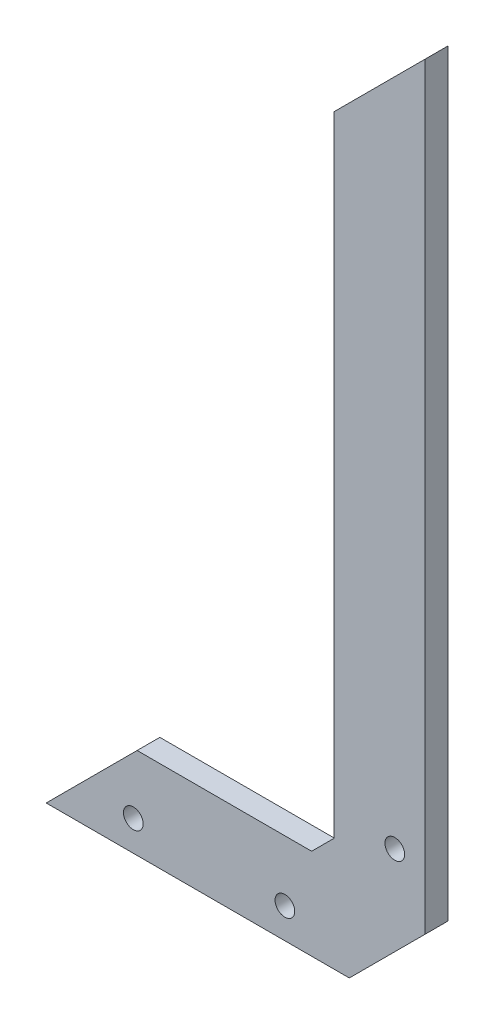
ISO-10303-21;
HEADER;
FILE_DESCRIPTION(('STEP AP214'),'2;1');
FILE_NAME('part.step','',(''),(''),'','','');
FILE_SCHEMA(('AUTOMOTIVE_DESIGN { 1 0 10303 214 1 1 1 1 }'));
ENDSEC;
DATA;
#1=APPLICATION_CONTEXT('core data for automotive mechanical design processes');
#2=APPLICATION_PROTOCOL_DEFINITION('international standard','automotive_design',2000,#1);
#3=PRODUCT_CONTEXT('',#1,'mechanical');
#4=PRODUCT('Part','Part','',(#3));
#5=PRODUCT_RELATED_PRODUCT_CATEGORY('part','',(#4));
#6=PRODUCT_DEFINITION_FORMATION('','',#4);
#7=PRODUCT_DEFINITION_CONTEXT('part definition',#1,'design');
#8=PRODUCT_DEFINITION('design','',#6,#7);
#9=PRODUCT_DEFINITION_SHAPE('','',#8);
#10=(LENGTH_UNIT() NAMED_UNIT(*) SI_UNIT(.MILLI.,.METRE.));
#11=(NAMED_UNIT(*) PLANE_ANGLE_UNIT() SI_UNIT($,.RADIAN.));
#12=(NAMED_UNIT(*) SI_UNIT($,.STERADIAN.) SOLID_ANGLE_UNIT());
#13=UNCERTAINTY_MEASURE_WITH_UNIT(LENGTH_MEASURE(1.E-05),#10,'distance_accuracy_value','');
#14=(GEOMETRIC_REPRESENTATION_CONTEXT(3) GLOBAL_UNCERTAINTY_ASSIGNED_CONTEXT((#13)) GLOBAL_UNIT_ASSIGNED_CONTEXT((#10,
#11,#12)) REPRESENTATION_CONTEXT('',''));
#15=CARTESIAN_POINT('',(0.,0.,0.));
#16=DIRECTION('',(0.,0.,1.));
#17=DIRECTION('',(1.,0.,0.));
#18=AXIS2_PLACEMENT_3D('',#15,#16,#17);
#19=CARTESIAN_POINT('',(0.,0.,3.));
#20=DIRECTION('',(0.,0.,1.));
#21=DIRECTION('',(1.,0.,0.));
#22=AXIS2_PLACEMENT_3D('',#19,#20,#21);
#23=PLANE('',#22);
#24=CARTESIAN_POINT('',(16.00000000005,14.2435457810132,3.));
#25=DIRECTION('',(0.,0.,1.));
#26=DIRECTION('',(1.,0.,0.));
#27=AXIS2_PLACEMENT_3D('',#24,#25,#26);
#28=CIRCLE('',#27,1.3);
#29=CARTESIAN_POINT('',(17.30000000005,14.2435457810132,3.));
#30=VERTEX_POINT('',#29);
#31=EDGE_CURVE('E182',#30,#30,#28,.T.);
#32=ORIENTED_EDGE('',*,*,#31,.F.);
#33=EDGE_LOOP('',(#32));
#34=FACE_BOUND('',#33,.T.);
#35=DIRECTION('',(-0.707106781186544,-0.707106781186552,0.));
#36=VECTOR('',#35,1.);
#37=CARTESIAN_POINT('',(16.5,22.2435457810132,3.));
#38=LINE('',#37,#36);
#39=CARTESIAN_POINT('',(16.5,22.2435457810132,3.));
#40=VERTEX_POINT('',#39);
#41=CARTESIAN_POINT('',(4.50000000000014,10.2435457810132,3.));
#42=VERTEX_POINT('',#41);
#43=EDGE_CURVE('E145',#40,#42,#38,.T.);
#44=ORIENTED_EDGE('',*,*,#43,.T.);
#45=DIRECTION('',(1.,0.,0.));
#46=VECTOR('',#45,1.);
#47=CARTESIAN_POINT('',(4.50000000000014,10.2435457810132,3.));
#48=LINE('',#47,#46);
#49=CARTESIAN_POINT('',(44.5000000000001,10.2435457810132,3.));
#50=VERTEX_POINT('',#49);
#51=EDGE_CURVE('E93',#42,#50,#48,.T.);
#52=ORIENTED_EDGE('',*,*,#51,.T.);
#53=DIRECTION('',(0.707106781186543,0.707106781186552,0.));
#54=VECTOR('',#53,1.);
#55=CARTESIAN_POINT('',(44.5000000000001,10.2435457810132,3.));
#56=LINE('',#55,#54);
#57=CARTESIAN_POINT('',(54.5,20.2435457810132,3.));
#58=VERTEX_POINT('',#57);
#59=EDGE_CURVE('E160',#50,#58,#56,.T.);
#60=ORIENTED_EDGE('',*,*,#59,.T.);
#61=DIRECTION('',(0.,1.,0.));
#62=VECTOR('',#61,1.);
#63=CARTESIAN_POINT('',(54.5,20.2435457810132,3.));
#64=LINE('',#63,#62);
#65=CARTESIAN_POINT('',(54.5,120.243545781013,3.));
#66=VERTEX_POINT('',#65);
#67=EDGE_CURVE('E173',#58,#66,#64,.T.);
#68=ORIENTED_EDGE('',*,*,#67,.T.);
#69=DIRECTION('',(-0.707106781186542,-0.707106781186553,0.));
#70=VECTOR('',#69,1.);
#71=CARTESIAN_POINT('',(54.5,120.243545781013,3.));
#72=LINE('',#71,#70);
#73=CARTESIAN_POINT('',(42.5,108.243545781013,3.));
#74=VERTEX_POINT('',#73);
#75=EDGE_CURVE('E112',#66,#74,#72,.T.);
#76=ORIENTED_EDGE('',*,*,#75,.T.);
#77=DIRECTION('',(0.,-1.,0.));
#78=VECTOR('',#77,1.);
#79=CARTESIAN_POINT('',(42.5,108.243545781013,3.));
#80=LINE('',#79,#78);
#81=CARTESIAN_POINT('',(42.5,25.2141085294903,3.));
#82=VERTEX_POINT('',#81);
#83=EDGE_CURVE('E106',#74,#82,#80,.T.);
#84=ORIENTED_EDGE('',*,*,#83,.T.);
#85=DIRECTION('',(-0.707106781186543,-0.707106781186552,0.));
#86=VECTOR('',#85,1.);
#87=CARTESIAN_POINT('',(42.5,25.2141085294903,3.));
#88=LINE('',#87,#86);
#89=CARTESIAN_POINT('',(39.529437251523,22.2435457810132,3.));
#90=VERTEX_POINT('',#89);
#91=EDGE_CURVE('E110',#82,#90,#88,.T.);
#92=ORIENTED_EDGE('',*,*,#91,.T.);
#93=DIRECTION('',(-1.,0.,0.));
#94=VECTOR('',#93,1.);
#95=CARTESIAN_POINT('',(39.529437251523,22.2435457810132,3.));
#96=LINE('',#95,#94);
#97=EDGE_CURVE('E50',#90,#40,#96,.T.);
#98=ORIENTED_EDGE('',*,*,#97,.T.);
#99=EDGE_LOOP('',(#44,#52,#60,#68,#76,#84,#92,#98));
#100=FACE_BOUND('',#99,.T.);
#101=CARTESIAN_POINT('',(50.5,28.0035457810132,3.));
#102=DIRECTION('',(0.,0.,1.));
#103=DIRECTION('',(1.,0.,0.));
#104=AXIS2_PLACEMENT_3D('',#101,#102,#103);
#105=CIRCLE('',#104,1.3);
#106=CARTESIAN_POINT('',(51.7999999999999,28.0035457810132,3.));
#107=VERTEX_POINT('',#106);
#108=EDGE_CURVE('E134',#107,#107,#105,.T.);
#109=ORIENTED_EDGE('',*,*,#108,.F.);
#110=EDGE_LOOP('',(#109));
#111=FACE_BOUND('',#110,.T.);
#112=CARTESIAN_POINT('',(36.00000000005,14.2435457810132,3.));
#113=DIRECTION('',(0.,0.,1.));
#114=DIRECTION('',(1.,0.,0.));
#115=AXIS2_PLACEMENT_3D('',#112,#113,#114);
#116=CIRCLE('',#115,1.3);
#117=CARTESIAN_POINT('',(37.30000000005,14.2435457810132,3.));
#118=VERTEX_POINT('',#117);
#119=EDGE_CURVE('E188',#118,#118,#116,.T.);
#120=ORIENTED_EDGE('',*,*,#119,.F.);
#121=EDGE_LOOP('',(#120));
#122=FACE_BOUND('',#121,.T.);
#123=ADVANCED_FACE('F33',(#34,#100,#111,#122),#23,.T.);
#124=CARTESIAN_POINT('',(0.,0.,0.));
#125=DIRECTION('',(0.,0.,1.));
#126=DIRECTION('',(1.,0.,0.));
#127=AXIS2_PLACEMENT_3D('',#124,#125,#126);
#128=PLANE('',#127);
#129=DIRECTION('',(-0.707106781186544,-0.707106781186552,0.));
#130=VECTOR('',#129,1.);
#131=CARTESIAN_POINT('',(16.5,22.2435457810132,0.));
#132=LINE('',#131,#130);
#133=CARTESIAN_POINT('',(16.5,22.2435457810132,0.));
#134=VERTEX_POINT('',#133);
#135=CARTESIAN_POINT('',(4.50000000000014,10.2435457810132,0.));
#136=VERTEX_POINT('',#135);
#137=EDGE_CURVE('E130',#134,#136,#132,.T.);
#138=ORIENTED_EDGE('',*,*,#137,.F.);
#139=DIRECTION('',(-1.,0.,0.));
#140=VECTOR('',#139,1.);
#141=CARTESIAN_POINT('',(39.529437251523,22.2435457810132,0.));
#142=LINE('',#141,#140);
#143=CARTESIAN_POINT('',(39.529437251523,22.2435457810132,0.));
#144=VERTEX_POINT('',#143);
#145=EDGE_CURVE('E85',#144,#134,#142,.T.);
#146=ORIENTED_EDGE('',*,*,#145,.F.);
#147=DIRECTION('',(-0.707106781186543,-0.707106781186552,0.));
#148=VECTOR('',#147,1.);
#149=CARTESIAN_POINT('',(42.5,25.2141085294903,0.));
#150=LINE('',#149,#148);
#151=CARTESIAN_POINT('',(42.5,25.2141085294903,0.));
#152=VERTEX_POINT('',#151);
#153=EDGE_CURVE('E79',#152,#144,#150,.T.);
#154=ORIENTED_EDGE('',*,*,#153,.F.);
#155=DIRECTION('',(0.,-1.,0.));
#156=VECTOR('',#155,1.);
#157=CARTESIAN_POINT('',(42.5,108.243545781013,0.));
#158=LINE('',#157,#156);
#159=CARTESIAN_POINT('',(42.5,108.243545781013,0.));
#160=VERTEX_POINT('',#159);
#161=EDGE_CURVE('E120',#160,#152,#158,.T.);
#162=ORIENTED_EDGE('',*,*,#161,.F.);
#163=DIRECTION('',(-0.707106781186542,-0.707106781186553,0.));
#164=VECTOR('',#163,1.);
#165=CARTESIAN_POINT('',(54.5,120.243545781013,0.));
#166=LINE('',#165,#164);
#167=CARTESIAN_POINT('',(54.5,120.243545781013,0.));
#168=VERTEX_POINT('',#167);
#169=EDGE_CURVE('E140',#168,#160,#166,.T.);
#170=ORIENTED_EDGE('',*,*,#169,.F.);
#171=DIRECTION('',(0.,1.,0.));
#172=VECTOR('',#171,1.);
#173=CARTESIAN_POINT('',(54.5,20.2435457810132,0.));
#174=LINE('',#173,#172);
#175=CARTESIAN_POINT('',(54.5,20.2435457810132,0.));
#176=VERTEX_POINT('',#175);
#177=EDGE_CURVE('E138',#176,#168,#174,.T.);
#178=ORIENTED_EDGE('',*,*,#177,.F.);
#179=DIRECTION('',(0.707106781186543,0.707106781186552,0.));
#180=VECTOR('',#179,1.);
#181=CARTESIAN_POINT('',(44.5000000000001,10.2435457810132,0.));
#182=LINE('',#181,#180);
#183=CARTESIAN_POINT('',(44.5000000000001,10.2435457810132,0.));
#184=VERTEX_POINT('',#183);
#185=EDGE_CURVE('E136',#184,#176,#182,.T.);
#186=ORIENTED_EDGE('',*,*,#185,.F.);
#187=DIRECTION('',(1.,0.,0.));
#188=VECTOR('',#187,1.);
#189=CARTESIAN_POINT('',(4.50000000000014,10.2435457810132,0.));
#190=LINE('',#189,#188);
#191=EDGE_CURVE('E133',#136,#184,#190,.T.);
#192=ORIENTED_EDGE('',*,*,#191,.F.);
#193=EDGE_LOOP('',(#138,#146,#154,#162,#170,#178,#186,#192));
#194=FACE_BOUND('',#193,.T.);
#195=CARTESIAN_POINT('',(50.5,28.0035457810132,0.));
#196=DIRECTION('',(0.,0.,1.));
#197=DIRECTION('',(1.,0.,0.));
#198=AXIS2_PLACEMENT_3D('',#195,#196,#197);
#199=CIRCLE('',#198,1.3);
#200=CARTESIAN_POINT('',(51.7999999999999,28.0035457810132,0.));
#201=VERTEX_POINT('',#200);
#202=EDGE_CURVE('E179',#201,#201,#199,.T.);
#203=ORIENTED_EDGE('',*,*,#202,.T.);
#204=EDGE_LOOP('',(#203));
#205=FACE_BOUND('',#204,.T.);
#206=CARTESIAN_POINT('',(16.00000000005,14.2435457810132,0.));
#207=DIRECTION('',(0.,0.,1.));
#208=DIRECTION('',(1.,0.,0.));
#209=AXIS2_PLACEMENT_3D('',#206,#207,#208);
#210=CIRCLE('',#209,1.3);
#211=CARTESIAN_POINT('',(17.30000000005,14.2435457810132,0.));
#212=VERTEX_POINT('',#211);
#213=EDGE_CURVE('E185',#212,#212,#210,.T.);
#214=ORIENTED_EDGE('',*,*,#213,.T.);
#215=EDGE_LOOP('',(#214));
#216=FACE_BOUND('',#215,.T.);
#217=CARTESIAN_POINT('',(36.00000000005,14.2435457810132,0.));
#218=DIRECTION('',(0.,0.,1.));
#219=DIRECTION('',(1.,0.,0.));
#220=AXIS2_PLACEMENT_3D('',#217,#218,#219);
#221=CIRCLE('',#220,1.3);
#222=CARTESIAN_POINT('',(37.30000000005,14.2435457810132,0.));
#223=VERTEX_POINT('',#222);
#224=EDGE_CURVE('E191',#223,#223,#221,.T.);
#225=ORIENTED_EDGE('',*,*,#224,.T.);
#226=EDGE_LOOP('',(#225));
#227=FACE_BOUND('',#226,.T.);
#228=ADVANCED_FACE('F164',(#194,#205,#216,#227),#128,.F.);
#229=CARTESIAN_POINT('',(16.5,22.2435457810132,3.));
#230=DIRECTION('',(0.707106781186551,-0.707106781186544,0.));
#231=DIRECTION('',(0.707106781186544,0.707106781186551,0.));
#232=AXIS2_PLACEMENT_3D('',#229,#230,#231);
#233=PLANE('',#232);
#234=ORIENTED_EDGE('',*,*,#137,.T.);
#235=DIRECTION('',(0.,0.,-1.));
#236=VECTOR('',#235,1.);
#237=CARTESIAN_POINT('',(4.50000000000014,10.2435457810132,3.));
#238=LINE('',#237,#236);
#239=EDGE_CURVE('E11',#42,#136,#238,.T.);
#240=ORIENTED_EDGE('',*,*,#239,.F.);
#241=ORIENTED_EDGE('',*,*,#43,.F.);
#242=DIRECTION('',(0.,0.,-1.));
#243=VECTOR('',#242,1.);
#244=CARTESIAN_POINT('',(16.5,22.2435457810132,3.));
#245=LINE('',#244,#243);
#246=EDGE_CURVE('E126',#40,#134,#245,.T.);
#247=ORIENTED_EDGE('',*,*,#246,.T.);
#248=EDGE_LOOP('',(#234,#240,#241,#247));
#249=FACE_BOUND('',#248,.T.);
#250=ADVANCED_FACE('F35',(#249),#233,.F.);
#251=CARTESIAN_POINT('',(4.50000000000014,10.2435457810132,3.));
#252=DIRECTION('',(0.,1.,0.));
#253=DIRECTION('',(0.,0.,1.));
#254=AXIS2_PLACEMENT_3D('',#251,#252,#253);
#255=PLANE('',#254);
#256=ORIENTED_EDGE('',*,*,#191,.T.);
#257=DIRECTION('',(0.,0.,-1.));
#258=VECTOR('',#257,1.);
#259=CARTESIAN_POINT('',(44.5000000000001,10.2435457810132,3.));
#260=LINE('',#259,#258);
#261=EDGE_CURVE('E42',#50,#184,#260,.T.);
#262=ORIENTED_EDGE('',*,*,#261,.F.);
#263=ORIENTED_EDGE('',*,*,#51,.F.);
#264=ORIENTED_EDGE('',*,*,#239,.T.);
#265=EDGE_LOOP('',(#256,#262,#263,#264));
#266=FACE_BOUND('',#265,.T.);
#267=ADVANCED_FACE('F224',(#266),#255,.F.);
#268=CARTESIAN_POINT('',(44.5000000000001,10.2435457810132,3.));
#269=DIRECTION('',(-0.707106781186552,0.707106781186543,0.));
#270=DIRECTION('',(-0.707106781186543,-0.707106781186552,0.));
#271=AXIS2_PLACEMENT_3D('',#268,#269,#270);
#272=PLANE('',#271);
#273=ORIENTED_EDGE('',*,*,#185,.T.);
#274=DIRECTION('',(0.,0.,-1.));
#275=VECTOR('',#274,1.);
#276=CARTESIAN_POINT('',(54.5,20.2435457810132,3.));
#277=LINE('',#276,#275);
#278=EDGE_CURVE('E152',#58,#176,#277,.T.);
#279=ORIENTED_EDGE('',*,*,#278,.F.);
#280=ORIENTED_EDGE('',*,*,#59,.F.);
#281=ORIENTED_EDGE('',*,*,#261,.T.);
#282=EDGE_LOOP('',(#273,#279,#280,#281));
#283=FACE_BOUND('',#282,.T.);
#284=ADVANCED_FACE('F158',(#283),#272,.F.);
#285=CARTESIAN_POINT('',(54.5,20.2435457810132,3.));
#286=DIRECTION('',(-1.,0.,0.));
#287=DIRECTION('',(0.,-1.,0.));
#288=AXIS2_PLACEMENT_3D('',#285,#286,#287);
#289=PLANE('',#288);
#290=ORIENTED_EDGE('',*,*,#177,.T.);
#291=DIRECTION('',(0.,0.,-1.));
#292=VECTOR('',#291,1.);
#293=CARTESIAN_POINT('',(54.5,120.243545781013,3.));
#294=LINE('',#293,#292);
#295=EDGE_CURVE('E149',#66,#168,#294,.T.);
#296=ORIENTED_EDGE('',*,*,#295,.F.);
#297=ORIENTED_EDGE('',*,*,#67,.F.);
#298=ORIENTED_EDGE('',*,*,#278,.T.);
#299=EDGE_LOOP('',(#290,#296,#297,#298));
#300=FACE_BOUND('',#299,.T.);
#301=ADVANCED_FACE('F169',(#300),#289,.F.);
#302=CARTESIAN_POINT('',(54.5,120.243545781013,3.));
#303=DIRECTION('',(0.707106781186553,-0.707106781186542,0.));
#304=DIRECTION('',(0.707106781186542,0.707106781186553,0.));
#305=AXIS2_PLACEMENT_3D('',#302,#303,#304);
#306=PLANE('',#305);
#307=ORIENTED_EDGE('',*,*,#169,.T.);
#308=DIRECTION('',(0.,0.,-1.));
#309=VECTOR('',#308,1.);
#310=CARTESIAN_POINT('',(42.5,108.243545781013,3.));
#311=LINE('',#310,#309);
#312=EDGE_CURVE('E121',#74,#160,#311,.T.);
#313=ORIENTED_EDGE('',*,*,#312,.F.);
#314=ORIENTED_EDGE('',*,*,#75,.F.);
#315=ORIENTED_EDGE('',*,*,#295,.T.);
#316=EDGE_LOOP('',(#307,#313,#314,#315));
#317=FACE_BOUND('',#316,.T.);
#318=ADVANCED_FACE('F172',(#317),#306,.F.);
#319=CARTESIAN_POINT('',(42.5,108.243545781013,3.));
#320=DIRECTION('',(1.,0.,0.));
#321=DIRECTION('',(0.,1.,0.));
#322=AXIS2_PLACEMENT_3D('',#319,#320,#321);
#323=PLANE('',#322);
#324=ORIENTED_EDGE('',*,*,#161,.T.);
#325=DIRECTION('',(0.,0.,-1.));
#326=VECTOR('',#325,1.);
#327=CARTESIAN_POINT('',(42.5,25.2141085294903,3.));
#328=LINE('',#327,#326);
#329=EDGE_CURVE('E117',#82,#152,#328,.T.);
#330=ORIENTED_EDGE('',*,*,#329,.F.);
#331=ORIENTED_EDGE('',*,*,#83,.F.);
#332=ORIENTED_EDGE('',*,*,#312,.T.);
#333=EDGE_LOOP('',(#324,#330,#331,#332));
#334=FACE_BOUND('',#333,.T.);
#335=ADVANCED_FACE('F118',(#334),#323,.F.);
#336=CARTESIAN_POINT('',(42.5,25.2141085294903,3.));
#337=DIRECTION('',(0.707106781186552,-0.707106781186543,0.));
#338=DIRECTION('',(0.707106781186543,0.707106781186552,0.));
#339=AXIS2_PLACEMENT_3D('',#336,#337,#338);
#340=PLANE('',#339);
#341=ORIENTED_EDGE('',*,*,#153,.T.);
#342=DIRECTION('',(0.,0.,-1.));
#343=VECTOR('',#342,1.);
#344=CARTESIAN_POINT('',(39.529437251523,22.2435457810132,3.));
#345=LINE('',#344,#343);
#346=EDGE_CURVE('E122',#90,#144,#345,.T.);
#347=ORIENTED_EDGE('',*,*,#346,.F.);
#348=ORIENTED_EDGE('',*,*,#91,.F.);
#349=ORIENTED_EDGE('',*,*,#329,.T.);
#350=EDGE_LOOP('',(#341,#347,#348,#349));
#351=FACE_BOUND('',#350,.T.);
#352=ADVANCED_FACE('F124',(#351),#340,.F.);
#353=CARTESIAN_POINT('',(39.529437251523,22.2435457810132,3.));
#354=DIRECTION('',(0.,-1.,0.));
#355=DIRECTION('',(1.,0.,0.));
#356=AXIS2_PLACEMENT_3D('',#353,#354,#355);
#357=PLANE('',#356);
#358=ORIENTED_EDGE('',*,*,#145,.T.);
#359=ORIENTED_EDGE('',*,*,#246,.F.);
#360=ORIENTED_EDGE('',*,*,#97,.F.);
#361=ORIENTED_EDGE('',*,*,#346,.T.);
#362=EDGE_LOOP('',(#358,#359,#360,#361));
#363=FACE_BOUND('',#362,.T.);
#364=ADVANCED_FACE('F212',(#363),#357,.F.);
#365=CARTESIAN_POINT('',(50.5,28.0035457810132,3.));
#366=DIRECTION('',(0.,0.,-1.));
#367=DIRECTION('',(-1.,0.,0.));
#368=AXIS2_PLACEMENT_3D('',#365,#366,#367);
#369=CYLINDRICAL_SURFACE('',#368,1.3);
#370=ORIENTED_EDGE('',*,*,#108,.T.);
#371=EDGE_LOOP('',(#370));
#372=FACE_BOUND('',#371,.T.);
#373=ORIENTED_EDGE('',*,*,#202,.F.);
#374=EDGE_LOOP('',(#373));
#375=FACE_BOUND('',#374,.T.);
#376=ADVANCED_FACE('F209',(#372,#375),#369,.F.);
#377=CARTESIAN_POINT('',(16.00000000005,14.2435457810132,3.));
#378=DIRECTION('',(0.,0.,-1.));
#379=DIRECTION('',(-1.,0.,0.));
#380=AXIS2_PLACEMENT_3D('',#377,#378,#379);
#381=CYLINDRICAL_SURFACE('',#380,1.3);
#382=ORIENTED_EDGE('',*,*,#31,.T.);
#383=EDGE_LOOP('',(#382));
#384=FACE_BOUND('',#383,.T.);
#385=ORIENTED_EDGE('',*,*,#213,.F.);
#386=EDGE_LOOP('',(#385));
#387=FACE_BOUND('',#386,.T.);
#388=ADVANCED_FACE('F288',(#384,#387),#381,.F.);
#389=CARTESIAN_POINT('',(36.00000000005,14.2435457810132,3.));
#390=DIRECTION('',(0.,0.,-1.));
#391=DIRECTION('',(-1.,0.,0.));
#392=AXIS2_PLACEMENT_3D('',#389,#390,#391);
#393=CYLINDRICAL_SURFACE('',#392,1.3);
#394=ORIENTED_EDGE('',*,*,#119,.T.);
#395=EDGE_LOOP('',(#394));
#396=FACE_BOUND('',#395,.T.);
#397=ORIENTED_EDGE('',*,*,#224,.F.);
#398=EDGE_LOOP('',(#397));
#399=FACE_BOUND('',#398,.T.);
#400=ADVANCED_FACE('F197',(#396,#399),#393,.F.);
#401=CLOSED_SHELL('',(#123,#228,#250,#267,#284,#301,#318,#335,#352,#364,#376,#388,#400));
#402=MANIFOLD_SOLID_BREP('B2',#401);
#403=ADVANCED_BREP_SHAPE_REPRESENTATION('',(#18,#402),#14);
#404=SHAPE_DEFINITION_REPRESENTATION(#9,#403);
ENDSEC;
END-ISO-10303-21;
